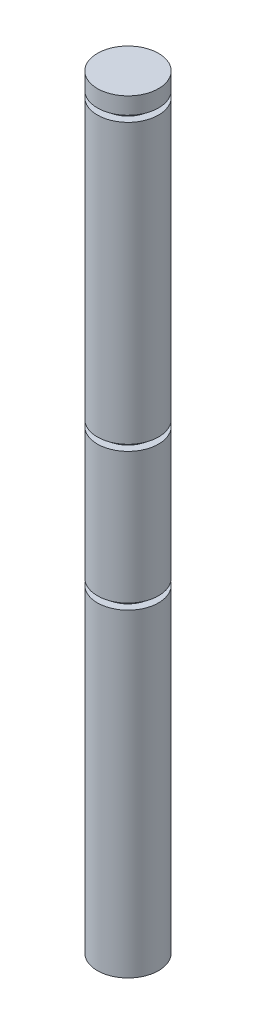
ISO-10303-21;
HEADER;
FILE_DESCRIPTION(('STEP AP214'),'2;1');
FILE_NAME('part.step','',(''),(''),'','','');
FILE_SCHEMA(('AUTOMOTIVE_DESIGN { 1 0 10303 214 1 1 1 1 }'));
ENDSEC;
DATA;
#1=APPLICATION_CONTEXT('core data for automotive mechanical design processes');
#2=APPLICATION_PROTOCOL_DEFINITION('international standard','automotive_design',2000,#1);
#3=PRODUCT_CONTEXT('',#1,'mechanical');
#4=PRODUCT('Part','Part','',(#3));
#5=PRODUCT_RELATED_PRODUCT_CATEGORY('part','',(#4));
#6=PRODUCT_DEFINITION_FORMATION('','',#4);
#7=PRODUCT_DEFINITION_CONTEXT('part definition',#1,'design');
#8=PRODUCT_DEFINITION('design','',#6,#7);
#9=PRODUCT_DEFINITION_SHAPE('','',#8);
#10=(LENGTH_UNIT() NAMED_UNIT(*) SI_UNIT(.MILLI.,.METRE.));
#11=(NAMED_UNIT(*) PLANE_ANGLE_UNIT() SI_UNIT($,.RADIAN.));
#12=(NAMED_UNIT(*) SI_UNIT($,.STERADIAN.) SOLID_ANGLE_UNIT());
#13=UNCERTAINTY_MEASURE_WITH_UNIT(LENGTH_MEASURE(1.E-05),#10,'distance_accuracy_value','');
#14=(GEOMETRIC_REPRESENTATION_CONTEXT(3) GLOBAL_UNCERTAINTY_ASSIGNED_CONTEXT((#13)) GLOBAL_UNIT_ASSIGNED_CONTEXT((#10,
#11,#12)) REPRESENTATION_CONTEXT('',''));
#15=CARTESIAN_POINT('',(0.,0.,0.));
#16=DIRECTION('',(0.,0.,1.));
#17=DIRECTION('',(1.,0.,0.));
#18=AXIS2_PLACEMENT_3D('',#15,#16,#17);
#19=CARTESIAN_POINT('',(0.,100.,0.));
#20=DIRECTION('',(0.,-1.,0.));
#21=DIRECTION('',(0.,0.,-1.));
#22=AXIS2_PLACEMENT_3D('',#19,#20,#21);
#23=CYLINDRICAL_SURFACE('',#22,4.);
#24=CARTESIAN_POINT('',(0.,59.7,0.));
#25=DIRECTION('',(0.,1.,0.));
#26=DIRECTION('',(0.,0.,1.));
#27=AXIS2_PLACEMENT_3D('',#24,#25,#26);
#28=CIRCLE('',#27,4.);
#29=CARTESIAN_POINT('',(0.,59.7,4.));
#30=VERTEX_POINT('',#29);
#31=EDGE_CURVE('E79',#30,#30,#28,.T.);
#32=ORIENTED_EDGE('',*,*,#31,.F.);
#33=EDGE_LOOP('',(#32));
#34=FACE_BOUND('',#33,.T.);
#35=CARTESIAN_POINT('',(0.,42.5,0.));
#36=DIRECTION('',(0.,1.,0.));
#37=DIRECTION('',(0.,0.,1.));
#38=AXIS2_PLACEMENT_3D('',#35,#36,#37);
#39=CIRCLE('',#38,4.);
#40=CARTESIAN_POINT('',(0.,42.5,4.));
#41=VERTEX_POINT('',#40);
#42=EDGE_CURVE('E83',#41,#41,#39,.T.);
#43=ORIENTED_EDGE('',*,*,#42,.T.);
#44=EDGE_LOOP('',(#43));
#45=FACE_BOUND('',#44,.T.);
#46=ADVANCED_FACE('F37',(#34,#45),#23,.T.);
#47=CARTESIAN_POINT('',(0.,97.,0.));
#48=DIRECTION('',(0.,1.,0.));
#49=DIRECTION('',(0.,0.,1.));
#50=AXIS2_PLACEMENT_3D('',#47,#48,#49);
#51=CIRCLE('',#50,4.);
#52=CARTESIAN_POINT('',(0.,97.,4.));
#53=VERTEX_POINT('',#52);
#54=EDGE_CURVE('E50',#53,#53,#51,.T.);
#55=ORIENTED_EDGE('',*,*,#54,.F.);
#56=EDGE_LOOP('',(#55));
#57=FACE_BOUND('',#56,.T.);
#58=CARTESIAN_POINT('',(0.,60.5,0.));
#59=DIRECTION('',(0.,1.,0.));
#60=DIRECTION('',(0.,0.,1.));
#61=AXIS2_PLACEMENT_3D('',#58,#59,#60);
#62=CIRCLE('',#61,4.);
#63=CARTESIAN_POINT('',(0.,60.5,4.));
#64=VERTEX_POINT('',#63);
#65=EDGE_CURVE('E67',#64,#64,#62,.T.);
#66=ORIENTED_EDGE('',*,*,#65,.T.);
#67=EDGE_LOOP('',(#66));
#68=FACE_BOUND('',#67,.T.);
#69=ADVANCED_FACE('F39',(#57,#68),#23,.T.);
#70=CARTESIAN_POINT('',(0.,97.,-4.));
#71=DIRECTION('',(0.,1.,0.));
#72=DIRECTION('',(0.,0.,1.));
#73=AXIS2_PLACEMENT_3D('',#70,#71,#72);
#74=PLANE('',#73);
#75=ORIENTED_EDGE('',*,*,#54,.T.);
#76=EDGE_LOOP('',(#75));
#77=FACE_BOUND('',#76,.T.);
#78=CARTESIAN_POINT('',(0.,97.,0.));
#79=DIRECTION('',(0.,1.,0.));
#80=DIRECTION('',(0.,0.,1.));
#81=AXIS2_PLACEMENT_3D('',#78,#79,#80);
#82=CIRCLE('',#81,3.);
#83=CARTESIAN_POINT('',(0.,97.,3.));
#84=VERTEX_POINT('',#83);
#85=EDGE_CURVE('E55',#84,#84,#82,.T.);
#86=ORIENTED_EDGE('',*,*,#85,.F.);
#87=EDGE_LOOP('',(#86));
#88=FACE_BOUND('',#87,.T.);
#89=ADVANCED_FACE('F121',(#77,#88),#74,.T.);
#90=CARTESIAN_POINT('',(0.,100.,0.));
#91=DIRECTION('',(0.,1.,0.));
#92=DIRECTION('',(0.,0.,1.));
#93=AXIS2_PLACEMENT_3D('',#90,#91,#92);
#94=CYLINDRICAL_SURFACE('',#93,3.);
#95=ORIENTED_EDGE('',*,*,#85,.T.);
#96=EDGE_LOOP('',(#95));
#97=FACE_BOUND('',#96,.T.);
#98=CARTESIAN_POINT('',(0.,97.8,0.));
#99=DIRECTION('',(0.,1.,0.));
#100=DIRECTION('',(0.,0.,1.));
#101=AXIS2_PLACEMENT_3D('',#98,#99,#100);
#102=CIRCLE('',#101,3.);
#103=CARTESIAN_POINT('',(0.,97.8,3.));
#104=VERTEX_POINT('',#103);
#105=EDGE_CURVE('E59',#104,#104,#102,.T.);
#106=ORIENTED_EDGE('',*,*,#105,.F.);
#107=EDGE_LOOP('',(#106));
#108=FACE_BOUND('',#107,.T.);
#109=ADVANCED_FACE('F153',(#97,#108),#94,.T.);
#110=CARTESIAN_POINT('',(0.,97.8,-4.));
#111=DIRECTION('',(0.,-1.,0.));
#112=DIRECTION('',(0.,0.,-1.));
#113=AXIS2_PLACEMENT_3D('',#110,#111,#112);
#114=PLANE('',#113);
#115=ORIENTED_EDGE('',*,*,#105,.T.);
#116=EDGE_LOOP('',(#115));
#117=FACE_BOUND('',#116,.T.);
#118=CARTESIAN_POINT('',(0.,97.8,0.));
#119=DIRECTION('',(0.,1.,0.));
#120=DIRECTION('',(0.,0.,1.));
#121=AXIS2_PLACEMENT_3D('',#118,#119,#120);
#122=CIRCLE('',#121,4.);
#123=CARTESIAN_POINT('',(0.,97.8,4.));
#124=VERTEX_POINT('',#123);
#125=EDGE_CURVE('E63',#124,#124,#122,.T.);
#126=ORIENTED_EDGE('',*,*,#125,.F.);
#127=EDGE_LOOP('',(#126));
#128=FACE_BOUND('',#127,.T.);
#129=ADVANCED_FACE('F150',(#117,#128),#114,.T.);
#130=CARTESIAN_POINT('',(0.,100.,0.));
#131=DIRECTION('',(0.,1.,0.));
#132=DIRECTION('',(0.,0.,1.));
#133=AXIS2_PLACEMENT_3D('',#130,#131,#132);
#134=PLANE('',#133);
#135=CARTESIAN_POINT('',(0.,100.,0.));
#136=DIRECTION('',(0.,1.,0.));
#137=DIRECTION('',(0.,0.,1.));
#138=AXIS2_PLACEMENT_3D('',#135,#136,#137);
#139=CIRCLE('',#138,4.);
#140=CARTESIAN_POINT('',(0.,100.,4.));
#141=VERTEX_POINT('',#140);
#142=EDGE_CURVE('E10',#141,#141,#139,.T.);
#143=ORIENTED_EDGE('',*,*,#142,.T.);
#144=EDGE_LOOP('',(#143));
#145=FACE_BOUND('',#144,.T.);
#146=ADVANCED_FACE('F114',(#145),#134,.T.);
#147=ORIENTED_EDGE('',*,*,#142,.F.);
#148=EDGE_LOOP('',(#147));
#149=FACE_BOUND('',#148,.T.);
#150=ORIENTED_EDGE('',*,*,#125,.T.);
#151=EDGE_LOOP('',(#150));
#152=FACE_BOUND('',#151,.T.);
#153=ADVANCED_FACE('F107',(#149,#152),#23,.T.);
#154=CARTESIAN_POINT('',(0.,60.5,-4.));
#155=DIRECTION('',(0.,-1.,0.));
#156=DIRECTION('',(0.,0.,-1.));
#157=AXIS2_PLACEMENT_3D('',#154,#155,#156);
#158=PLANE('',#157);
#159=CARTESIAN_POINT('',(0.,60.5,0.));
#160=DIRECTION('',(0.,1.,0.));
#161=DIRECTION('',(0.,0.,1.));
#162=AXIS2_PLACEMENT_3D('',#159,#160,#161);
#163=CIRCLE('',#162,3.);
#164=CARTESIAN_POINT('',(0.,60.5,3.));
#165=VERTEX_POINT('',#164);
#166=EDGE_CURVE('E71',#165,#165,#163,.T.);
#167=ORIENTED_EDGE('',*,*,#166,.T.);
#168=EDGE_LOOP('',(#167));
#169=FACE_BOUND('',#168,.T.);
#170=ORIENTED_EDGE('',*,*,#65,.F.);
#171=EDGE_LOOP('',(#170));
#172=FACE_BOUND('',#171,.T.);
#173=ADVANCED_FACE('F113',(#169,#172),#158,.T.);
#174=CARTESIAN_POINT('',(0.,100.,0.));
#175=DIRECTION('',(0.,1.,0.));
#176=DIRECTION('',(0.,0.,1.));
#177=AXIS2_PLACEMENT_3D('',#174,#175,#176);
#178=CYLINDRICAL_SURFACE('',#177,3.);
#179=CARTESIAN_POINT('',(0.,59.7,0.));
#180=DIRECTION('',(0.,1.,0.));
#181=DIRECTION('',(0.,0.,1.));
#182=AXIS2_PLACEMENT_3D('',#179,#180,#181);
#183=CIRCLE('',#182,3.);
#184=CARTESIAN_POINT('',(0.,59.7,3.));
#185=VERTEX_POINT('',#184);
#186=EDGE_CURVE('E75',#185,#185,#183,.T.);
#187=ORIENTED_EDGE('',*,*,#186,.T.);
#188=EDGE_LOOP('',(#187));
#189=FACE_BOUND('',#188,.T.);
#190=ORIENTED_EDGE('',*,*,#166,.F.);
#191=EDGE_LOOP('',(#190));
#192=FACE_BOUND('',#191,.T.);
#193=ADVANCED_FACE('F139',(#189,#192),#178,.T.);
#194=CARTESIAN_POINT('',(0.,59.7,-4.));
#195=DIRECTION('',(0.,1.,0.));
#196=DIRECTION('',(0.,0.,1.));
#197=AXIS2_PLACEMENT_3D('',#194,#195,#196);
#198=PLANE('',#197);
#199=ORIENTED_EDGE('',*,*,#31,.T.);
#200=EDGE_LOOP('',(#199));
#201=FACE_BOUND('',#200,.T.);
#202=ORIENTED_EDGE('',*,*,#186,.F.);
#203=EDGE_LOOP('',(#202));
#204=FACE_BOUND('',#203,.T.);
#205=ADVANCED_FACE('F130',(#201,#204),#198,.T.);
#206=CARTESIAN_POINT('',(0.,42.5,-4.));
#207=DIRECTION('',(0.,-1.,0.));
#208=DIRECTION('',(0.,0.,-1.));
#209=AXIS2_PLACEMENT_3D('',#206,#207,#208);
#210=PLANE('',#209);
#211=CARTESIAN_POINT('',(0.,42.5,0.));
#212=DIRECTION('',(0.,1.,0.));
#213=DIRECTION('',(0.,0.,1.));
#214=AXIS2_PLACEMENT_3D('',#211,#212,#213);
#215=CIRCLE('',#214,3.);
#216=CARTESIAN_POINT('',(0.,42.5,3.));
#217=VERTEX_POINT('',#216);
#218=EDGE_CURVE('E87',#217,#217,#215,.T.);
#219=ORIENTED_EDGE('',*,*,#218,.T.);
#220=EDGE_LOOP('',(#219));
#221=FACE_BOUND('',#220,.T.);
#222=ORIENTED_EDGE('',*,*,#42,.F.);
#223=EDGE_LOOP('',(#222));
#224=FACE_BOUND('',#223,.T.);
#225=ADVANCED_FACE('F127',(#221,#224),#210,.T.);
#226=CARTESIAN_POINT('',(0.,82.,0.));
#227=DIRECTION('',(0.,1.,0.));
#228=DIRECTION('',(0.,0.,1.));
#229=AXIS2_PLACEMENT_3D('',#226,#227,#228);
#230=CYLINDRICAL_SURFACE('',#229,3.);
#231=CARTESIAN_POINT('',(0.,41.7,0.));
#232=DIRECTION('',(0.,1.,0.));
#233=DIRECTION('',(0.,0.,1.));
#234=AXIS2_PLACEMENT_3D('',#231,#232,#233);
#235=CIRCLE('',#234,3.);
#236=CARTESIAN_POINT('',(0.,41.7,3.));
#237=VERTEX_POINT('',#236);
#238=EDGE_CURVE('E91',#237,#237,#235,.T.);
#239=ORIENTED_EDGE('',*,*,#238,.T.);
#240=EDGE_LOOP('',(#239));
#241=FACE_BOUND('',#240,.T.);
#242=ORIENTED_EDGE('',*,*,#218,.F.);
#243=EDGE_LOOP('',(#242));
#244=FACE_BOUND('',#243,.T.);
#245=ADVANCED_FACE('F129',(#241,#244),#230,.T.);
#246=CARTESIAN_POINT('',(0.,41.7,-4.));
#247=DIRECTION('',(0.,1.,0.));
#248=DIRECTION('',(0.,0.,1.));
#249=AXIS2_PLACEMENT_3D('',#246,#247,#248);
#250=PLANE('',#249);
#251=CARTESIAN_POINT('',(0.,41.7,0.));
#252=DIRECTION('',(0.,1.,0.));
#253=DIRECTION('',(0.,0.,1.));
#254=AXIS2_PLACEMENT_3D('',#251,#252,#253);
#255=CIRCLE('',#254,4.);
#256=CARTESIAN_POINT('',(0.,41.7,4.));
#257=VERTEX_POINT('',#256);
#258=EDGE_CURVE('E95',#257,#257,#255,.T.);
#259=ORIENTED_EDGE('',*,*,#258,.T.);
#260=EDGE_LOOP('',(#259));
#261=FACE_BOUND('',#260,.T.);
#262=ORIENTED_EDGE('',*,*,#238,.F.);
#263=EDGE_LOOP('',(#262));
#264=FACE_BOUND('',#263,.T.);
#265=ADVANCED_FACE('F100',(#261,#264),#250,.T.);
#266=CARTESIAN_POINT('',(0.,0.,0.));
#267=DIRECTION('',(0.,1.,0.));
#268=DIRECTION('',(0.,0.,1.));
#269=AXIS2_PLACEMENT_3D('',#266,#267,#268);
#270=PLANE('',#269);
#271=CARTESIAN_POINT('',(0.,0.,0.));
#272=DIRECTION('',(0.,1.,0.));
#273=DIRECTION('',(0.,0.,1.));
#274=AXIS2_PLACEMENT_3D('',#271,#272,#273);
#275=CIRCLE('',#274,4.);
#276=CARTESIAN_POINT('',(0.,0.,4.));
#277=VERTEX_POINT('',#276);
#278=EDGE_CURVE('E41',#277,#277,#275,.T.);
#279=ORIENTED_EDGE('',*,*,#278,.F.);
#280=EDGE_LOOP('',(#279));
#281=FACE_BOUND('',#280,.T.);
#282=ADVANCED_FACE('F105',(#281),#270,.F.);
#283=ORIENTED_EDGE('',*,*,#278,.T.);
#284=EDGE_LOOP('',(#283));
#285=FACE_BOUND('',#284,.T.);
#286=ORIENTED_EDGE('',*,*,#258,.F.);
#287=EDGE_LOOP('',(#286));
#288=FACE_BOUND('',#287,.T.);
#289=ADVANCED_FACE('F103',(#285,#288),#23,.T.);
#290=CLOSED_SHELL('',(#46,#69,#89,#109,#129,#146,#153,#173,#193,#205,#225,#245,#265,#282,#289));
#291=MANIFOLD_SOLID_BREP('B2',#290);
#292=ADVANCED_BREP_SHAPE_REPRESENTATION('',(#18,#291),#14);
#293=SHAPE_DEFINITION_REPRESENTATION(#9,#292);
ENDSEC;
END-ISO-10303-21;
